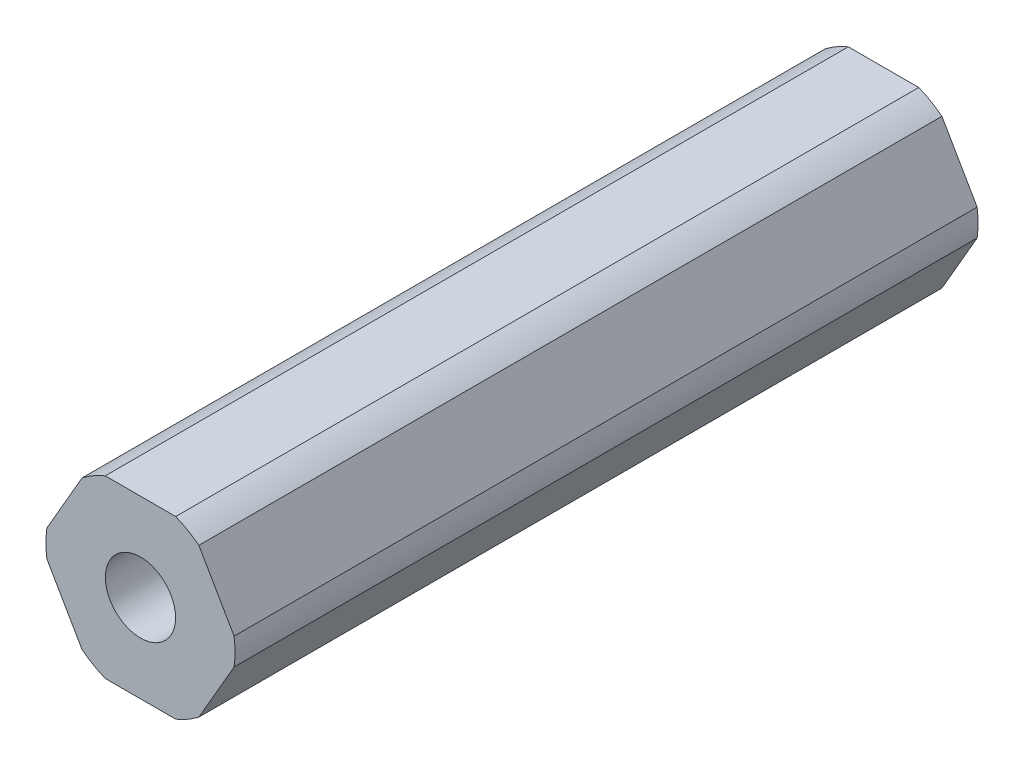
ISO-10303-21;
HEADER;
FILE_DESCRIPTION(('STEP AP214'),'2;1');
FILE_NAME('part.step','',(''),(''),'','','');
FILE_SCHEMA(('AUTOMOTIVE_DESIGN { 1 0 10303 214 1 1 1 1 }'));
ENDSEC;
DATA;
#1=APPLICATION_CONTEXT('core data for automotive mechanical design processes');
#2=APPLICATION_PROTOCOL_DEFINITION('international standard','automotive_design',2000,#1);
#3=PRODUCT_CONTEXT('',#1,'mechanical');
#4=PRODUCT('Part','Part','',(#3));
#5=PRODUCT_RELATED_PRODUCT_CATEGORY('part','',(#4));
#6=PRODUCT_DEFINITION_FORMATION('','',#4);
#7=PRODUCT_DEFINITION_CONTEXT('part definition',#1,'design');
#8=PRODUCT_DEFINITION('design','',#6,#7);
#9=PRODUCT_DEFINITION_SHAPE('','',#8);
#10=(LENGTH_UNIT() NAMED_UNIT(*) SI_UNIT(.MILLI.,.METRE.));
#11=(NAMED_UNIT(*) PLANE_ANGLE_UNIT() SI_UNIT($,.RADIAN.));
#12=(NAMED_UNIT(*) SI_UNIT($,.STERADIAN.) SOLID_ANGLE_UNIT());
#13=UNCERTAINTY_MEASURE_WITH_UNIT(LENGTH_MEASURE(1.E-05),#10,'distance_accuracy_value','');
#14=(GEOMETRIC_REPRESENTATION_CONTEXT(3) GLOBAL_UNCERTAINTY_ASSIGNED_CONTEXT((#13)) GLOBAL_UNIT_ASSIGNED_CONTEXT((#10,
#11,#12)) REPRESENTATION_CONTEXT('',''));
#15=CARTESIAN_POINT('',(0.,0.,0.));
#16=DIRECTION('',(0.,0.,1.));
#17=DIRECTION('',(1.,0.,0.));
#18=AXIS2_PLACEMENT_3D('',#15,#16,#17);
#19=CARTESIAN_POINT('',(0.,0.,-26.9875));
#20=DIRECTION('',(0.,0.,1.));
#21=DIRECTION('',(1.,0.,0.));
#22=AXIS2_PLACEMENT_3D('',#19,#20,#21);
#23=CYLINDRICAL_SURFACE('',#22,6.87);
#24=DIRECTION('',(0.,0.,1.));
#25=VECTOR('',#24,1.);
#26=CARTESIAN_POINT('',(6.80102150534208,0.97108520937895,26.9875));
#27=LINE('',#26,#25);
#28=CARTESIAN_POINT('',(6.80102150534208,0.971085209378948,-26.9875));
#29=VERTEX_POINT('',#28);
#30=CARTESIAN_POINT('',(6.80102150534208,0.971085209378948,26.9875));
#31=VERTEX_POINT('',#30);
#32=EDGE_CURVE('E109',#29,#31,#27,.T.);
#33=ORIENTED_EDGE('',*,*,#32,.T.);
#34=CARTESIAN_POINT('',(0.,0.,26.9875));
#35=DIRECTION('',(0.,0.,1.));
#36=DIRECTION('',(1.,0.,0.));
#37=AXIS2_PLACEMENT_3D('',#34,#35,#36);
#38=CIRCLE('',#37,6.87);
#39=CARTESIAN_POINT('',(6.80102150534208,-0.971085209378954,26.9875));
#40=VERTEX_POINT('',#39);
#41=EDGE_CURVE('E104',#31,#40,#38,.F.);
#42=ORIENTED_EDGE('',*,*,#41,.T.);
#43=DIRECTION('',(0.,0.,1.));
#44=VECTOR('',#43,1.);
#45=CARTESIAN_POINT('',(6.80102150534208,-0.971085209378955,26.9875));
#46=LINE('',#45,#44);
#47=CARTESIAN_POINT('',(6.80102150534208,-0.971085209378953,-26.9875));
#48=VERTEX_POINT('',#47);
#49=EDGE_CURVE('E106',#40,#48,#46,.F.);
#50=ORIENTED_EDGE('',*,*,#49,.T.);
#51=CARTESIAN_POINT('',(0.,0.,-26.9875));
#52=DIRECTION('',(0.,0.,1.));
#53=DIRECTION('',(1.,0.,0.));
#54=AXIS2_PLACEMENT_3D('',#51,#52,#53);
#55=CIRCLE('',#54,6.87);
#56=EDGE_CURVE('E20',#48,#29,#55,.T.);
#57=ORIENTED_EDGE('',*,*,#56,.T.);
#58=EDGE_LOOP('',(#33,#42,#50,#57));
#59=FACE_BOUND('',#58,.T.);
#60=ADVANCED_FACE('F17',(#59),#23,.T.);
#61=CARTESIAN_POINT('',(3.68083890619154,6.3754,26.9875));
#62=DIRECTION('',(0.,-1.,0.));
#63=DIRECTION('',(1.,0.,0.));
#64=AXIS2_PLACEMENT_3D('',#61,#62,#63);
#65=PLANE('',#64);
#66=DIRECTION('',(1.,0.,0.));
#67=VECTOR('',#66,1.);
#68=CARTESIAN_POINT('',(0.,6.3754,-26.9875));
#69=LINE('',#68,#67);
#70=CARTESIAN_POINT('',(2.55952629210953,6.37540000000001,-26.9875));
#71=VERTEX_POINT('',#70);
#72=CARTESIAN_POINT('',(-2.55952629210953,6.37540000000001,-26.9875));
#73=VERTEX_POINT('',#72);
#74=EDGE_CURVE('E128',#71,#73,#69,.F.);
#75=ORIENTED_EDGE('',*,*,#74,.T.);
#76=DIRECTION('',(0.,0.,1.));
#77=VECTOR('',#76,1.);
#78=CARTESIAN_POINT('',(-2.55952629210953,6.37540000000001,-26.9875));
#79=LINE('',#78,#77);
#80=CARTESIAN_POINT('',(-2.55952629210953,6.37540000000001,26.9875));
#81=VERTEX_POINT('',#80);
#82=EDGE_CURVE('E113',#81,#73,#79,.F.);
#83=ORIENTED_EDGE('',*,*,#82,.F.);
#84=DIRECTION('',(1.,0.,0.));
#85=VECTOR('',#84,1.);
#86=CARTESIAN_POINT('',(0.,6.3754,26.9875));
#87=LINE('',#86,#85);
#88=CARTESIAN_POINT('',(2.55952629210953,6.37540000000001,26.9875));
#89=VERTEX_POINT('',#88);
#90=EDGE_CURVE('E145',#89,#81,#87,.F.);
#91=ORIENTED_EDGE('',*,*,#90,.F.);
#92=DIRECTION('',(0.,0.,1.));
#93=VECTOR('',#92,1.);
#94=CARTESIAN_POINT('',(2.55952629210953,6.37540000000001,-26.9875));
#95=LINE('',#94,#93);
#96=EDGE_CURVE('E150',#71,#89,#95,.T.);
#97=ORIENTED_EDGE('',*,*,#96,.F.);
#98=EDGE_LOOP('',(#75,#83,#91,#97));
#99=FACE_BOUND('',#98,.T.);
#100=ADVANCED_FACE('F197',(#99),#65,.F.);
#101=CARTESIAN_POINT('',(0.,0.,-26.9875));
#102=DIRECTION('',(0.,0.,1.));
#103=DIRECTION('',(1.,0.,0.));
#104=AXIS2_PLACEMENT_3D('',#101,#102,#103);
#105=CYLINDRICAL_SURFACE('',#104,6.87);
#106=DIRECTION('',(0.,0.,1.));
#107=VECTOR('',#106,1.);
#108=CARTESIAN_POINT('',(-4.24149521323255,5.40431479062104,26.9875));
#109=LINE('',#108,#107);
#110=CARTESIAN_POINT('',(-4.24149521323255,5.40431479062105,-26.9875));
#111=VERTEX_POINT('',#110);
#112=CARTESIAN_POINT('',(-4.24149521323255,5.40431479062105,26.9875));
#113=VERTEX_POINT('',#112);
#114=EDGE_CURVE('E166',#111,#113,#109,.T.);
#115=ORIENTED_EDGE('',*,*,#114,.T.);
#116=CARTESIAN_POINT('',(0.,0.,26.9875));
#117=DIRECTION('',(0.,0.,1.));
#118=DIRECTION('',(1.,0.,0.));
#119=AXIS2_PLACEMENT_3D('',#116,#117,#118);
#120=CIRCLE('',#119,6.87);
#121=EDGE_CURVE('E144',#81,#113,#120,.T.);
#122=ORIENTED_EDGE('',*,*,#121,.F.);
#123=ORIENTED_EDGE('',*,*,#82,.T.);
#124=CARTESIAN_POINT('',(0.,0.,-26.9875));
#125=DIRECTION('',(0.,0.,1.));
#126=DIRECTION('',(1.,0.,0.));
#127=AXIS2_PLACEMENT_3D('',#124,#125,#126);
#128=CIRCLE('',#127,6.87);
#129=EDGE_CURVE('E131',#73,#111,#128,.T.);
#130=ORIENTED_EDGE('',*,*,#129,.T.);
#131=EDGE_LOOP('',(#115,#122,#123,#130));
#132=FACE_BOUND('',#131,.T.);
#133=ADVANCED_FACE('F201',(#132),#105,.T.);
#134=CARTESIAN_POINT('',(-3.68083890619154,6.3754,26.9875));
#135=DIRECTION('',(0.866025403784439,-0.5,0.));
#136=DIRECTION('',(0.5,0.866025403784439,0.));
#137=AXIS2_PLACEMENT_3D('',#134,#135,#136);
#138=PLANE('',#137);
#139=DIRECTION('',(-0.5,-0.866025403784439,0.));
#140=VECTOR('',#139,1.);
#141=CARTESIAN_POINT('',(-4.24149521323255,5.40431479062104,-26.9875));
#142=LINE('',#141,#140);
#143=CARTESIAN_POINT('',(-6.80102150534208,0.971085209378961,-26.9875));
#144=VERTEX_POINT('',#143);
#145=EDGE_CURVE('E186',#111,#144,#142,.T.);
#146=ORIENTED_EDGE('',*,*,#145,.T.);
#147=DIRECTION('',(0.,0.,1.));
#148=VECTOR('',#147,1.);
#149=CARTESIAN_POINT('',(-6.80102150534208,0.971085209378959,-26.9875));
#150=LINE('',#149,#148);
#151=CARTESIAN_POINT('',(-6.80102150534208,0.971085209378961,26.9875));
#152=VERTEX_POINT('',#151);
#153=EDGE_CURVE('E164',#152,#144,#150,.F.);
#154=ORIENTED_EDGE('',*,*,#153,.F.);
#155=DIRECTION('',(-0.5,-0.866025403784439,0.));
#156=VECTOR('',#155,1.);
#157=CARTESIAN_POINT('',(-4.24149521323255,5.40431479062104,26.9875));
#158=LINE('',#157,#156);
#159=EDGE_CURVE('E142',#113,#152,#158,.T.);
#160=ORIENTED_EDGE('',*,*,#159,.F.);
#161=ORIENTED_EDGE('',*,*,#114,.F.);
#162=EDGE_LOOP('',(#146,#154,#160,#161));
#163=FACE_BOUND('',#162,.T.);
#164=ADVANCED_FACE('F207',(#163),#138,.F.);
#165=CARTESIAN_POINT('',(0.,0.,-26.9875));
#166=DIRECTION('',(0.,0.,1.));
#167=DIRECTION('',(1.,0.,0.));
#168=AXIS2_PLACEMENT_3D('',#165,#166,#167);
#169=CYLINDRICAL_SURFACE('',#168,6.87);
#170=DIRECTION('',(0.,0.,1.));
#171=VECTOR('',#170,1.);
#172=CARTESIAN_POINT('',(-6.80102150534208,-0.971085209378956,26.9875));
#173=LINE('',#172,#171);
#174=CARTESIAN_POINT('',(-6.80102150534208,-0.971085209378956,-26.9875));
#175=VERTEX_POINT('',#174);
#176=CARTESIAN_POINT('',(-6.80102150534208,-0.971085209378955,26.9875));
#177=VERTEX_POINT('',#176);
#178=EDGE_CURVE('E161',#175,#177,#173,.T.);
#179=ORIENTED_EDGE('',*,*,#178,.T.);
#180=CARTESIAN_POINT('',(0.,0.,26.9875));
#181=DIRECTION('',(0.,0.,1.));
#182=DIRECTION('',(1.,0.,0.));
#183=AXIS2_PLACEMENT_3D('',#180,#181,#182);
#184=CIRCLE('',#183,6.87);
#185=EDGE_CURVE('E141',#152,#177,#184,.T.);
#186=ORIENTED_EDGE('',*,*,#185,.F.);
#187=ORIENTED_EDGE('',*,*,#153,.T.);
#188=CARTESIAN_POINT('',(0.,0.,-26.9875));
#189=DIRECTION('',(0.,0.,1.));
#190=DIRECTION('',(1.,0.,0.));
#191=AXIS2_PLACEMENT_3D('',#188,#189,#190);
#192=CIRCLE('',#191,6.87);
#193=EDGE_CURVE('E183',#144,#175,#192,.T.);
#194=ORIENTED_EDGE('',*,*,#193,.T.);
#195=EDGE_LOOP('',(#179,#186,#187,#194));
#196=FACE_BOUND('',#195,.T.);
#197=ADVANCED_FACE('F211',(#196),#169,.T.);
#198=CARTESIAN_POINT('',(-7.36167781238308,0.,26.9875));
#199=DIRECTION('',(0.866025403784439,0.5,0.));
#200=DIRECTION('',(-0.5,0.866025403784439,0.));
#201=AXIS2_PLACEMENT_3D('',#198,#199,#200);
#202=PLANE('',#201);
#203=DIRECTION('',(0.5,-0.866025403784438,0.));
#204=VECTOR('',#203,1.);
#205=CARTESIAN_POINT('',(-6.80102150534208,-0.971085209378956,-26.9875));
#206=LINE('',#205,#204);
#207=CARTESIAN_POINT('',(-4.24149521323254,-5.40431479062105,-26.9875));
#208=VERTEX_POINT('',#207);
#209=EDGE_CURVE('E182',#175,#208,#206,.T.);
#210=ORIENTED_EDGE('',*,*,#209,.T.);
#211=DIRECTION('',(0.,0.,1.));
#212=VECTOR('',#211,1.);
#213=CARTESIAN_POINT('',(-4.24149521323255,-5.40431479062105,-26.9875));
#214=LINE('',#213,#212);
#215=CARTESIAN_POINT('',(-4.24149521323255,-5.40431479062105,26.9875));
#216=VERTEX_POINT('',#215);
#217=EDGE_CURVE('E159',#216,#208,#214,.F.);
#218=ORIENTED_EDGE('',*,*,#217,.F.);
#219=DIRECTION('',(0.5,-0.866025403784439,0.));
#220=VECTOR('',#219,1.);
#221=CARTESIAN_POINT('',(-6.80102150534208,-0.971085209378956,26.9875));
#222=LINE('',#221,#220);
#223=EDGE_CURVE('E139',#177,#216,#222,.T.);
#224=ORIENTED_EDGE('',*,*,#223,.F.);
#225=ORIENTED_EDGE('',*,*,#178,.F.);
#226=EDGE_LOOP('',(#210,#218,#224,#225));
#227=FACE_BOUND('',#226,.T.);
#228=ADVANCED_FACE('F217',(#227),#202,.F.);
#229=CARTESIAN_POINT('',(0.,0.,-26.9875));
#230=DIRECTION('',(0.,0.,1.));
#231=DIRECTION('',(1.,0.,0.));
#232=AXIS2_PLACEMENT_3D('',#229,#230,#231);
#233=CYLINDRICAL_SURFACE('',#232,6.87);
#234=DIRECTION('',(0.,0.,1.));
#235=VECTOR('',#234,1.);
#236=CARTESIAN_POINT('',(-2.55952629210953,-6.3754,26.9875));
#237=LINE('',#236,#235);
#238=CARTESIAN_POINT('',(-2.55952629210953,-6.3754,-26.9875));
#239=VERTEX_POINT('',#238);
#240=CARTESIAN_POINT('',(-2.55952629210953,-6.3754,26.9875));
#241=VERTEX_POINT('',#240);
#242=EDGE_CURVE('E156',#239,#241,#237,.T.);
#243=ORIENTED_EDGE('',*,*,#242,.T.);
#244=CARTESIAN_POINT('',(0.,0.,26.9875));
#245=DIRECTION('',(0.,0.,1.));
#246=DIRECTION('',(1.,0.,0.));
#247=AXIS2_PLACEMENT_3D('',#244,#245,#246);
#248=CIRCLE('',#247,6.87);
#249=EDGE_CURVE('E138',#216,#241,#248,.T.);
#250=ORIENTED_EDGE('',*,*,#249,.F.);
#251=ORIENTED_EDGE('',*,*,#217,.T.);
#252=CARTESIAN_POINT('',(0.,0.,-26.9875));
#253=DIRECTION('',(0.,0.,1.));
#254=DIRECTION('',(1.,0.,0.));
#255=AXIS2_PLACEMENT_3D('',#252,#253,#254);
#256=CIRCLE('',#255,6.87);
#257=EDGE_CURVE('E179',#208,#239,#256,.T.);
#258=ORIENTED_EDGE('',*,*,#257,.T.);
#259=EDGE_LOOP('',(#243,#250,#251,#258));
#260=FACE_BOUND('',#259,.T.);
#261=ADVANCED_FACE('F222',(#260),#233,.T.);
#262=CARTESIAN_POINT('',(-3.68083890619154,-6.3754,26.9875));
#263=DIRECTION('',(0.,1.,0.));
#264=DIRECTION('',(0.,0.,1.));
#265=AXIS2_PLACEMENT_3D('',#262,#263,#264);
#266=PLANE('',#265);
#267=DIRECTION('',(1.,0.,0.));
#268=VECTOR('',#267,1.);
#269=CARTESIAN_POINT('',(0.,-6.3754,-26.9875));
#270=LINE('',#269,#268);
#271=CARTESIAN_POINT('',(2.55952629210953,-6.3754,-26.9875));
#272=VERTEX_POINT('',#271);
#273=EDGE_CURVE('E178',#239,#272,#270,.T.);
#274=ORIENTED_EDGE('',*,*,#273,.T.);
#275=DIRECTION('',(0.,0.,1.));
#276=VECTOR('',#275,1.);
#277=CARTESIAN_POINT('',(2.55952629210953,-6.3754,-26.9875));
#278=LINE('',#277,#276);
#279=CARTESIAN_POINT('',(2.55952629210953,-6.3754,26.9875));
#280=VERTEX_POINT('',#279);
#281=EDGE_CURVE('E121',#280,#272,#278,.F.);
#282=ORIENTED_EDGE('',*,*,#281,.F.);
#283=DIRECTION('',(1.,0.,0.));
#284=VECTOR('',#283,1.);
#285=CARTESIAN_POINT('',(0.,-6.3754,26.9875));
#286=LINE('',#285,#284);
#287=EDGE_CURVE('E133',#241,#280,#286,.T.);
#288=ORIENTED_EDGE('',*,*,#287,.F.);
#289=ORIENTED_EDGE('',*,*,#242,.F.);
#290=EDGE_LOOP('',(#274,#282,#288,#289));
#291=FACE_BOUND('',#290,.T.);
#292=ADVANCED_FACE('F227',(#291),#266,.F.);
#293=CARTESIAN_POINT('',(0.,0.,-26.9875));
#294=DIRECTION('',(0.,0.,1.));
#295=DIRECTION('',(1.,0.,0.));
#296=AXIS2_PLACEMENT_3D('',#293,#294,#295);
#297=CYLINDRICAL_SURFACE('',#296,6.87);
#298=ORIENTED_EDGE('',*,*,#281,.T.);
#299=CARTESIAN_POINT('',(0.,0.,-26.9875));
#300=DIRECTION('',(0.,0.,1.));
#301=DIRECTION('',(1.,0.,0.));
#302=AXIS2_PLACEMENT_3D('',#299,#300,#301);
#303=CIRCLE('',#302,6.87);
#304=CARTESIAN_POINT('',(4.24149521323254,-5.40431479062105,-26.9875));
#305=VERTEX_POINT('',#304);
#306=EDGE_CURVE('E175',#272,#305,#303,.T.);
#307=ORIENTED_EDGE('',*,*,#306,.T.);
#308=DIRECTION('',(0.,0.,1.));
#309=VECTOR('',#308,1.);
#310=CARTESIAN_POINT('',(4.24149521323254,-5.40431479062105,26.9875));
#311=LINE('',#310,#309);
#312=CARTESIAN_POINT('',(4.24149521323254,-5.40431479062105,26.9875));
#313=VERTEX_POINT('',#312);
#314=EDGE_CURVE('E120',#305,#313,#311,.T.);
#315=ORIENTED_EDGE('',*,*,#314,.T.);
#316=CARTESIAN_POINT('',(0.,0.,26.9875));
#317=DIRECTION('',(0.,0.,1.));
#318=DIRECTION('',(1.,0.,0.));
#319=AXIS2_PLACEMENT_3D('',#316,#317,#318);
#320=CIRCLE('',#319,6.87);
#321=EDGE_CURVE('E126',#280,#313,#320,.T.);
#322=ORIENTED_EDGE('',*,*,#321,.F.);
#323=EDGE_LOOP('',(#298,#307,#315,#322));
#324=FACE_BOUND('',#323,.T.);
#325=ADVANCED_FACE('F230',(#324),#297,.T.);
#326=CARTESIAN_POINT('',(3.68083890619154,-6.3754,26.9875));
#327=DIRECTION('',(-0.866025403784439,0.5,0.));
#328=DIRECTION('',(-0.5,-0.866025403784439,0.));
#329=AXIS2_PLACEMENT_3D('',#326,#327,#328);
#330=PLANE('',#329);
#331=DIRECTION('',(0.5,0.866025403784439,0.));
#332=VECTOR('',#331,1.);
#333=CARTESIAN_POINT('',(4.24149521323254,-5.40431479062105,-26.9875));
#334=LINE('',#333,#332);
#335=EDGE_CURVE('E119',#305,#48,#334,.T.);
#336=ORIENTED_EDGE('',*,*,#335,.T.);
#337=ORIENTED_EDGE('',*,*,#49,.F.);
#338=DIRECTION('',(0.5,0.866025403784439,0.));
#339=VECTOR('',#338,1.);
#340=CARTESIAN_POINT('',(4.24149521323254,-5.40431479062105,26.9875));
#341=LINE('',#340,#339);
#342=EDGE_CURVE('E117',#313,#40,#341,.T.);
#343=ORIENTED_EDGE('',*,*,#342,.F.);
#344=ORIENTED_EDGE('',*,*,#314,.F.);
#345=EDGE_LOOP('',(#336,#337,#343,#344));
#346=FACE_BOUND('',#345,.T.);
#347=ADVANCED_FACE('F116',(#346),#330,.F.);
#348=CARTESIAN_POINT('',(7.36167781238308,0.,26.9875));
#349=DIRECTION('',(-0.866025403784439,-0.5,0.));
#350=DIRECTION('',(0.5,-0.866025403784439,0.));
#351=AXIS2_PLACEMENT_3D('',#348,#349,#350);
#352=PLANE('',#351);
#353=DIRECTION('',(-0.5,0.866025403784438,0.));
#354=VECTOR('',#353,1.);
#355=CARTESIAN_POINT('',(6.80102150534208,0.97108520937895,-26.9875));
#356=LINE('',#355,#354);
#357=CARTESIAN_POINT('',(4.24149521323254,5.40431479062105,-26.9875));
#358=VERTEX_POINT('',#357);
#359=EDGE_CURVE('E174',#29,#358,#356,.T.);
#360=ORIENTED_EDGE('',*,*,#359,.T.);
#361=DIRECTION('',(0.,0.,1.));
#362=VECTOR('',#361,1.);
#363=CARTESIAN_POINT('',(4.24149521323254,5.40431479062105,-26.9875));
#364=LINE('',#363,#362);
#365=CARTESIAN_POINT('',(4.24149521323254,5.40431479062105,26.9875));
#366=VERTEX_POINT('',#365);
#367=EDGE_CURVE('E35',#366,#358,#364,.F.);
#368=ORIENTED_EDGE('',*,*,#367,.F.);
#369=DIRECTION('',(-0.5,0.866025403784438,0.));
#370=VECTOR('',#369,1.);
#371=CARTESIAN_POINT('',(6.80102150534208,0.97108520937895,26.9875));
#372=LINE('',#371,#370);
#373=EDGE_CURVE('E148',#31,#366,#372,.T.);
#374=ORIENTED_EDGE('',*,*,#373,.F.);
#375=ORIENTED_EDGE('',*,*,#32,.F.);
#376=EDGE_LOOP('',(#360,#368,#374,#375));
#377=FACE_BOUND('',#376,.T.);
#378=ADVANCED_FACE('F242',(#377),#352,.F.);
#379=CARTESIAN_POINT('',(0.,0.,-26.9875));
#380=DIRECTION('',(0.,0.,1.));
#381=DIRECTION('',(1.,0.,0.));
#382=AXIS2_PLACEMENT_3D('',#379,#380,#381);
#383=CYLINDRICAL_SURFACE('',#382,6.87);
#384=ORIENTED_EDGE('',*,*,#96,.T.);
#385=CARTESIAN_POINT('',(0.,0.,26.9875));
#386=DIRECTION('',(0.,0.,1.));
#387=DIRECTION('',(1.,0.,0.));
#388=AXIS2_PLACEMENT_3D('',#385,#386,#387);
#389=CIRCLE('',#388,6.87);
#390=EDGE_CURVE('E147',#366,#89,#389,.T.);
#391=ORIENTED_EDGE('',*,*,#390,.F.);
#392=ORIENTED_EDGE('',*,*,#367,.T.);
#393=CARTESIAN_POINT('',(0.,0.,-26.9875));
#394=DIRECTION('',(0.,0.,1.));
#395=DIRECTION('',(1.,0.,0.));
#396=AXIS2_PLACEMENT_3D('',#393,#394,#395);
#397=CIRCLE('',#396,6.87);
#398=EDGE_CURVE('E172',#358,#71,#397,.T.);
#399=ORIENTED_EDGE('',*,*,#398,.T.);
#400=EDGE_LOOP('',(#384,#391,#392,#399));
#401=FACE_BOUND('',#400,.T.);
#402=ADVANCED_FACE('F244',(#401),#383,.T.);
#403=CARTESIAN_POINT('',(0.,0.,26.9875));
#404=DIRECTION('',(0.,0.,1.));
#405=DIRECTION('',(1.,0.,0.));
#406=AXIS2_PLACEMENT_3D('',#403,#404,#405);
#407=PLANE('',#406);
#408=ORIENTED_EDGE('',*,*,#342,.T.);
#409=ORIENTED_EDGE('',*,*,#41,.F.);
#410=ORIENTED_EDGE('',*,*,#373,.T.);
#411=ORIENTED_EDGE('',*,*,#390,.T.);
#412=ORIENTED_EDGE('',*,*,#90,.T.);
#413=ORIENTED_EDGE('',*,*,#121,.T.);
#414=ORIENTED_EDGE('',*,*,#159,.T.);
#415=ORIENTED_EDGE('',*,*,#185,.T.);
#416=ORIENTED_EDGE('',*,*,#223,.T.);
#417=ORIENTED_EDGE('',*,*,#249,.T.);
#418=ORIENTED_EDGE('',*,*,#287,.T.);
#419=ORIENTED_EDGE('',*,*,#321,.T.);
#420=EDGE_LOOP('',(#408,#409,#410,#411,#412,#413,#414,#415,#416,#417,#418,#419));
#421=FACE_BOUND('',#420,.T.);
#422=CARTESIAN_POINT('',(0.,0.,26.9875));
#423=DIRECTION('',(0.,0.,1.));
#424=DIRECTION('',(1.,0.,0.));
#425=AXIS2_PLACEMENT_3D('',#422,#423,#424);
#426=CIRCLE('',#425,2.55);
#427=CARTESIAN_POINT('',(2.55,0.,26.9875));
#428=VERTEX_POINT('',#427);
#429=EDGE_CURVE('E26',#428,#428,#426,.F.);
#430=ORIENTED_EDGE('',*,*,#429,.T.);
#431=EDGE_LOOP('',(#430));
#432=FACE_BOUND('',#431,.T.);
#433=ADVANCED_FACE('F123',(#421,#432),#407,.T.);
#434=CARTESIAN_POINT('',(0.,0.,-26.9875));
#435=DIRECTION('',(0.,0.,1.));
#436=DIRECTION('',(1.,0.,0.));
#437=AXIS2_PLACEMENT_3D('',#434,#435,#436);
#438=PLANE('',#437);
#439=ORIENTED_EDGE('',*,*,#359,.F.);
#440=ORIENTED_EDGE('',*,*,#56,.F.);
#441=ORIENTED_EDGE('',*,*,#335,.F.);
#442=ORIENTED_EDGE('',*,*,#306,.F.);
#443=ORIENTED_EDGE('',*,*,#273,.F.);
#444=ORIENTED_EDGE('',*,*,#257,.F.);
#445=ORIENTED_EDGE('',*,*,#209,.F.);
#446=ORIENTED_EDGE('',*,*,#193,.F.);
#447=ORIENTED_EDGE('',*,*,#145,.F.);
#448=ORIENTED_EDGE('',*,*,#129,.F.);
#449=ORIENTED_EDGE('',*,*,#74,.F.);
#450=ORIENTED_EDGE('',*,*,#398,.F.);
#451=EDGE_LOOP('',(#439,#440,#441,#442,#443,#444,#445,#446,#447,#448,#449,#450));
#452=FACE_BOUND('',#451,.T.);
#453=CARTESIAN_POINT('',(0.,0.,-26.9875));
#454=DIRECTION('',(0.,0.,1.));
#455=DIRECTION('',(1.,0.,0.));
#456=AXIS2_PLACEMENT_3D('',#453,#454,#455);
#457=CIRCLE('',#456,2.55);
#458=CARTESIAN_POINT('',(2.55,0.,-26.9875));
#459=VERTEX_POINT('',#458);
#460=EDGE_CURVE('E11',#459,#459,#457,.T.);
#461=ORIENTED_EDGE('',*,*,#460,.T.);
#462=EDGE_LOOP('',(#461));
#463=FACE_BOUND('',#462,.T.);
#464=ADVANCED_FACE('F234',(#452,#463),#438,.F.);
#465=CARTESIAN_POINT('',(0.,0.,-26.9875));
#466=DIRECTION('',(0.,0.,1.));
#467=DIRECTION('',(1.,0.,0.));
#468=AXIS2_PLACEMENT_3D('',#465,#466,#467);
#469=CYLINDRICAL_SURFACE('',#468,2.55);
#470=ORIENTED_EDGE('',*,*,#429,.F.);
#471=EDGE_LOOP('',(#470));
#472=FACE_BOUND('',#471,.T.);
#473=ORIENTED_EDGE('',*,*,#460,.F.);
#474=EDGE_LOOP('',(#473));
#475=FACE_BOUND('',#474,.T.);
#476=ADVANCED_FACE('F253',(#472,#475),#469,.F.);
#477=CLOSED_SHELL('',(#60,#100,#133,#164,#197,#228,#261,#292,#325,#347,#378,#402,#433,#464,#476));
#478=MANIFOLD_SOLID_BREP('B1',#477);
#479=ADVANCED_BREP_SHAPE_REPRESENTATION('',(#18,#478),#14);
#480=SHAPE_DEFINITION_REPRESENTATION(#9,#479);
ENDSEC;
END-ISO-10303-21;
